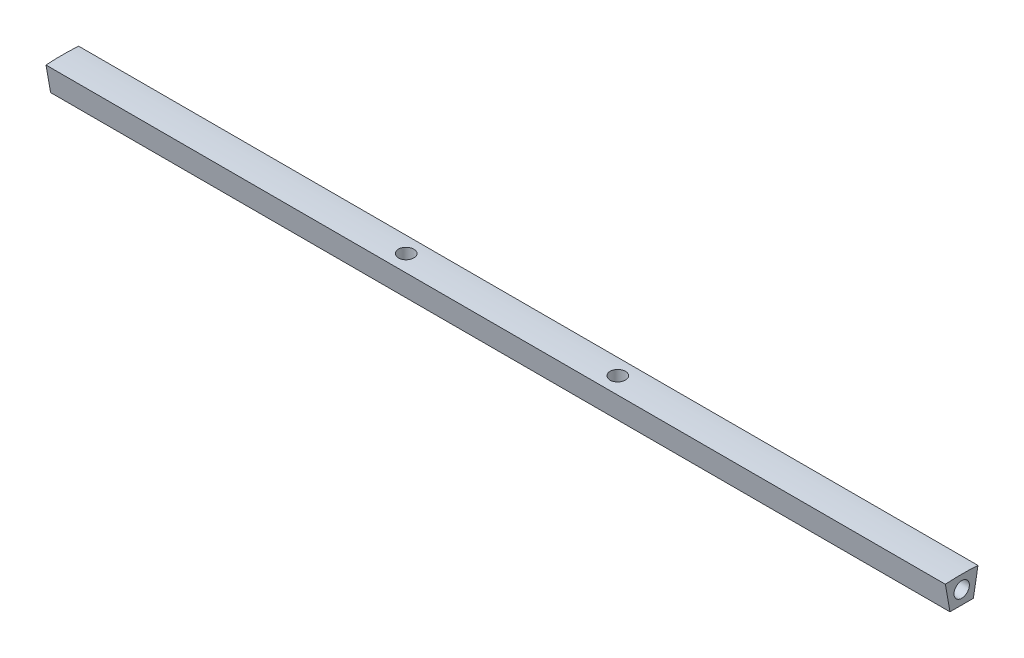
ISO-10303-21;
HEADER;
FILE_DESCRIPTION(('STEP AP214'),'2;1');
FILE_NAME('part.step','',(''),(''),'','','');
FILE_SCHEMA(('AUTOMOTIVE_DESIGN { 1 0 10303 214 1 1 1 1 }'));
ENDSEC;
DATA;
#1=APPLICATION_CONTEXT('core data for automotive mechanical design processes');
#2=APPLICATION_PROTOCOL_DEFINITION('international standard','automotive_design',2000,#1);
#3=PRODUCT_CONTEXT('',#1,'mechanical');
#4=PRODUCT('Part','Part','',(#3));
#5=PRODUCT_RELATED_PRODUCT_CATEGORY('part','',(#4));
#6=PRODUCT_DEFINITION_FORMATION('','',#4);
#7=PRODUCT_DEFINITION_CONTEXT('part definition',#1,'design');
#8=PRODUCT_DEFINITION('design','',#6,#7);
#9=PRODUCT_DEFINITION_SHAPE('','',#8);
#10=(LENGTH_UNIT() NAMED_UNIT(*) SI_UNIT(.MILLI.,.METRE.));
#11=(NAMED_UNIT(*) PLANE_ANGLE_UNIT() SI_UNIT($,.RADIAN.));
#12=(NAMED_UNIT(*) SI_UNIT($,.STERADIAN.) SOLID_ANGLE_UNIT());
#13=UNCERTAINTY_MEASURE_WITH_UNIT(LENGTH_MEASURE(1.E-05),#10,'distance_accuracy_value','');
#14=(GEOMETRIC_REPRESENTATION_CONTEXT(3) GLOBAL_UNCERTAINTY_ASSIGNED_CONTEXT((#13)) GLOBAL_UNIT_ASSIGNED_CONTEXT((#10,
#11,#12)) REPRESENTATION_CONTEXT('',''));
#15=CARTESIAN_POINT('',(0.,0.,0.));
#16=DIRECTION('',(0.,0.,1.));
#17=DIRECTION('',(1.,0.,0.));
#18=AXIS2_PLACEMENT_3D('',#15,#16,#17);
#19=CARTESIAN_POINT('',(85.,-27.3954375763557,0.));
#20=DIRECTION('',(-1.,0.,0.));
#21=DIRECTION('',(0.,0.,1.));
#22=AXIS2_PLACEMENT_3D('',#19,#20,#21);
#23=CYLINDRICAL_SURFACE('',#22,45.);
#24=CARTESIAN_POINT('',(-20.,17.5811952455887,-1.45));
#25=CARTESIAN_POINT('',(-19.9185755497555,17.581195560761,-1.44999639610573));
#26=CARTESIAN_POINT('',(-19.8370925971932,17.5814187337444,-1.44311841747033));
#27=CARTESIAN_POINT('',(-19.6763723313141,17.5822875221371,-1.41577711239342));
#28=CARTESIAN_POINT('',(-19.5971378150299,17.5829336415507,-1.39529757721871));
#29=CARTESIAN_POINT('',(-19.4432660134703,17.5845750552256,-1.34133816620006));
#30=CARTESIAN_POINT('',(-19.3686264918343,17.5855701780237,-1.30786467333882));
#31=CARTESIAN_POINT('',(-19.2260468688721,17.5877972491246,-1.22887674760692));
#32=CARTESIAN_POINT('',(-19.1581051423356,17.5890291397609,-1.18336524566251));
#33=CARTESIAN_POINT('',(-19.0307946192462,17.5915916607824,-1.08156652534249));
#34=CARTESIAN_POINT('',(-18.9714295130754,17.5929223333011,-1.02527469244733));
#35=CARTESIAN_POINT('',(-18.8629885047085,17.5955320587645,-0.903521480900382));
#36=CARTESIAN_POINT('',(-18.8139130131351,17.5968111096473,-0.838059736483198));
#37=CARTESIAN_POINT('',(-18.7274377940149,17.5991736442441,-0.699810266714487));
#38=CARTESIAN_POINT('',(-18.6900403912631,17.6002570890001,-0.627021086475463));
#39=CARTESIAN_POINT('',(-18.6279980145996,17.602105937575,-0.476193311351547));
#40=CARTESIAN_POINT('',(-18.6033529856492,17.6028713427666,-0.398154739124511));
#41=CARTESIAN_POINT('',(-18.567523177646,17.6039975967257,-0.239072314134422));
#42=CARTESIAN_POINT('',(-18.5563336912468,17.6043585869724,-0.158029522614945));
#43=CARTESIAN_POINT('',(-18.5477180910554,17.6046357939974,0.00478488025085344));
#44=CARTESIAN_POINT('',(-18.5502919177388,17.6045520126992,0.0865564884436184));
#45=CARTESIAN_POINT('',(-18.5691259176608,17.6039492413491,0.248475441193944));
#46=CARTESIAN_POINT('',(-18.5853810111596,17.603430412827,0.328623377298196));
#47=CARTESIAN_POINT('',(-18.6311082620197,17.6020162035603,0.485052254433794));
#48=CARTESIAN_POINT('',(-18.6605804507213,17.6011208219229,0.561333186295265));
#49=CARTESIAN_POINT('',(-18.7319111073349,17.5990541374583,0.707879059718868));
#50=CARTESIAN_POINT('',(-18.7737719018922,17.5978827828103,0.778142868034791));
#51=CARTESIAN_POINT('',(-18.8686897681545,17.5953961527433,0.9106475342358));
#52=CARTESIAN_POINT('',(-18.9217468700721,17.5940808769359,0.972888370470564));
#53=CARTESIAN_POINT('',(-19.0375800039693,17.5914539165918,1.0876099174053));
#54=CARTESIAN_POINT('',(-19.1003604435621,17.5901422339596,1.14008617793174));
#55=CARTESIAN_POINT('',(-19.2338426022834,17.5876709415424,1.23375469869195));
#56=CARTESIAN_POINT('',(-19.3045443227692,17.5865113317834,1.27494695699253));
#57=CARTESIAN_POINT('',(-19.4518645915983,17.5844749835096,1.34487769586793));
#58=CARTESIAN_POINT('',(-19.5284832094087,17.5835982483165,1.37361603020187));
#59=CARTESIAN_POINT('',(-19.6854612008433,17.582226646271,1.41782026852071));
#60=CARTESIAN_POINT('',(-19.7658205627223,17.5817317782196,1.43328621417523));
#61=CARTESIAN_POINT('',(-19.9279602042983,17.5811799277435,1.45050118830187));
#62=CARTESIAN_POINT('',(-20.0097398286705,17.5811227484762,1.45225638294296));
#63=CARTESIAN_POINT('',(-20.1724325696063,17.5814522093725,1.44201610203598));
#64=CARTESIAN_POINT('',(-20.2533456873345,17.5818388489395,1.43002064496979));
#65=CARTESIAN_POINT('',(-20.4119913625379,17.5830121829073,1.39262467641642));
#66=CARTESIAN_POINT('',(-20.4897245816199,17.5837987936284,1.36722696883111));
#67=CARTESIAN_POINT('',(-20.6398242090057,17.5856833255105,1.30375029232191));
#68=CARTESIAN_POINT('',(-20.7121906047513,17.5867812474,1.26567129372515));
#69=CARTESIAN_POINT('',(-20.8495307610811,17.5891651154822,1.17789707576103));
#70=CARTESIAN_POINT('',(-20.9145018669467,17.5904511288187,1.12819770440988));
#71=CARTESIAN_POINT('',(-21.0351804793051,17.5930659712476,1.018599619213));
#72=CARTESIAN_POINT('',(-21.090887959087,17.5943948004633,0.958700875959209));
#73=CARTESIAN_POINT('',(-21.1914785729168,17.5969460507688,0.830377941325694));
#74=CARTESIAN_POINT('',(-21.236357730029,17.5981684326585,0.761950631595954));
#75=CARTESIAN_POINT('',(-21.3139905509964,17.6003684382501,0.618528866792554));
#76=CARTESIAN_POINT('',(-21.3467442443823,17.6013460625482,0.543534427713156));
#77=CARTESIAN_POINT('',(-21.3991894068048,17.6029461639872,0.389122199102358));
#78=CARTESIAN_POINT('',(-21.4188834495715,17.6035687111016,0.309705284476179));
#79=CARTESIAN_POINT('',(-21.4446587085623,17.6043887602366,0.148690078274115));
#80=CARTESIAN_POINT('',(-21.4507399423086,17.6045862628042,0.067091789506192));
#81=CARTESIAN_POINT('',(-21.4491166661379,17.6045339642031,-0.0959301631536992));
#82=CARTESIAN_POINT('',(-21.4414184184504,17.6042843662238,-0.177353889541331));
#83=CARTESIAN_POINT('',(-21.4124675914789,17.6033663876483,-0.337752548323752));
#84=CARTESIAN_POINT('',(-21.3912149854502,17.6026980062259,-0.416727475886395));
#85=CARTESIAN_POINT('',(-21.335759663018,17.601017738147,-0.569988930491637));
#86=CARTESIAN_POINT('',(-21.3015567369522,17.6000058459292,-0.644275381606328));
#87=CARTESIAN_POINT('',(-21.2211736125113,17.5977525525986,-0.786050309944264));
#88=CARTESIAN_POINT('',(-21.1749938416078,17.5965111596776,-0.853539029669344));
#89=CARTESIAN_POINT('',(-21.0719486540127,17.5939381420972,-0.979832024541534));
#90=CARTESIAN_POINT('',(-21.0150795268562,17.592606486209,-1.03863327141638));
#91=CARTESIAN_POINT('',(-20.8922601580862,17.5900030367265,-1.14587017928332));
#92=CARTESIAN_POINT('',(-20.8263076725901,17.5887312580283,-1.1943032714316));
#93=CARTESIAN_POINT('',(-20.6871656913398,17.5863905082374,-1.27943850646351));
#94=CARTESIAN_POINT('',(-20.6139713405715,17.5853216746215,-1.31613270875393));
#95=CARTESIAN_POINT('',(-20.4625138171707,17.5835098212649,-1.3766687565962));
#96=CARTESIAN_POINT('',(-20.3842568093504,17.582766413515,-1.40052591573039));
#97=CARTESIAN_POINT('',(-20.2545884632373,17.5818878005388,-1.42839386265571));
#98=CARTESIAN_POINT('',(-20.2040186315184,17.5816292222113,-1.43648595639032));
#99=CARTESIAN_POINT('',(-20.1023068996895,17.5812828457423,-1.44729015643992));
#100=CARTESIAN_POINT('',(-20.0511649997749,17.5811950475426,-1.45000226459312));
#101=CARTESIAN_POINT('',(-20.,17.5811952455887,-1.45));
#102=B_SPLINE_CURVE_WITH_KNOTS('',3,(#24,#25,#26,#27,#28,#29,#30,#31,#32,#33,#34,#35,#36,#37,
#38,#39,#40,#41,#42,#43,#44,#45,#46,#47,#48,#49,#50,#51,#52,#53,#54,#55,#56,#57,#58,#59,#60,#61,
#62,#63,#64,#65,#66,#67,#68,#69,#70,#71,#72,#73,#74,#75,#76,#77,#78,#79,#80,#81,#82,#83,#84,#85,
#86,#87,#88,#89,#90,#91,#92,#93,#94,#95,#96,#97,#98,#99,#100,#101),.UNSPECIFIED.,.T.,.F.,(4,2,2,
2,2,2,2,2,2,2,2,2,2,2,2,2,2,2,2,2,2,2,2,2,2,2,2,2,2,2,2,2,2,2,2,2,2,2,4),(0.,0.24408659065921,
0.488464578135991,0.732722672151012,0.976921350648962,1.22122479295396,1.46553798270357,
1.70989977771351,1.9542605180567,2.19853574526446,2.44280991601687,2.68699342980523,
2.931177522602,3.1754075035857,3.41963814362032,3.66397981980311,3.90832153784673,
4.15266612500845,4.39700994502987,4.64124386938818,4.88547746547869,5.12965998539411,
5.37384307667462,5.6181135487785,5.86238472520444,6.10674547940481,6.35110563848043,
6.59541762596839,6.83972929898211,7.08392997018898,7.32813112323952,7.57233623001097,
7.81653262193724,8.06081393582274,8.30515570367844,8.54966240502629,8.7938767788072,
8.94725447538027,9.1006321195477),.UNSPECIFIED.);
#103=CARTESIAN_POINT('',(-20.,17.5811952455887,-1.45));
#104=VERTEX_POINT('',#103);
#105=EDGE_CURVE('E147',#104,#104,#102,.T.);
#106=ORIENTED_EDGE('',*,*,#105,.T.);
#107=EDGE_LOOP('',(#106));
#108=FACE_BOUND('',#107,.T.);
#109=CARTESIAN_POINT('',(20.,17.5811952455887,-1.45));
#110=CARTESIAN_POINT('',(20.0814244502446,17.581195560761,-1.44999639610573));
#111=CARTESIAN_POINT('',(20.1629074028068,17.5814187337444,-1.44311841747033));
#112=CARTESIAN_POINT('',(20.3236276686859,17.5822875221371,-1.41577711239342));
#113=CARTESIAN_POINT('',(20.4028621849702,17.5829336415507,-1.39529757721871));
#114=CARTESIAN_POINT('',(20.5567339865297,17.5845750552256,-1.34133816620006));
#115=CARTESIAN_POINT('',(20.6313735081658,17.5855701780237,-1.30786467333882));
#116=CARTESIAN_POINT('',(20.773953131128,17.5877972491246,-1.22887674760692));
#117=CARTESIAN_POINT('',(20.8418948576645,17.5890291397609,-1.18336524566251));
#118=CARTESIAN_POINT('',(20.9692053807538,17.5915916607824,-1.08156652534249));
#119=CARTESIAN_POINT('',(21.0285704869247,17.5929223333011,-1.02527469244733));
#120=CARTESIAN_POINT('',(21.1370114952915,17.5955320587645,-0.903521480900382));
#121=CARTESIAN_POINT('',(21.1860869868649,17.5968111096473,-0.838059736483198));
#122=CARTESIAN_POINT('',(21.2725622059851,17.5991736442441,-0.699810266714487));
#123=CARTESIAN_POINT('',(21.3099596087369,17.6002570890001,-0.627021086475463));
#124=CARTESIAN_POINT('',(21.3720019854004,17.602105937575,-0.476193311351547));
#125=CARTESIAN_POINT('',(21.3966470143509,17.6028713427666,-0.398154739124511));
#126=CARTESIAN_POINT('',(21.4324768223541,17.6039975967257,-0.239072314134422));
#127=CARTESIAN_POINT('',(21.4436663087532,17.6043585869724,-0.158029522614945));
#128=CARTESIAN_POINT('',(21.4522819089446,17.6046357939974,0.00478488025085344));
#129=CARTESIAN_POINT('',(21.4497080822612,17.6045520126992,0.0865564884436184));
#130=CARTESIAN_POINT('',(21.4308740823392,17.6039492413491,0.248475441193944));
#131=CARTESIAN_POINT('',(21.4146189888404,17.603430412827,0.328623377298196));
#132=CARTESIAN_POINT('',(21.3688917379803,17.6020162035603,0.485052254433794));
#133=CARTESIAN_POINT('',(21.3394195492788,17.6011208219229,0.561333186295265));
#134=CARTESIAN_POINT('',(21.2680888926651,17.5990541374583,0.707879059718868));
#135=CARTESIAN_POINT('',(21.2262280981078,17.5978827828103,0.778142868034791));
#136=CARTESIAN_POINT('',(21.1313102318455,17.5953961527433,0.9106475342358));
#137=CARTESIAN_POINT('',(21.0782531299279,17.5940808769359,0.972888370470564));
#138=CARTESIAN_POINT('',(20.9624199960307,17.5914539165918,1.0876099174053));
#139=CARTESIAN_POINT('',(20.899639556438,17.5901422339596,1.14008617793174));
#140=CARTESIAN_POINT('',(20.7661573977166,17.5876709415424,1.23375469869195));
#141=CARTESIAN_POINT('',(20.6954556772308,17.5865113317834,1.27494695699253));
#142=CARTESIAN_POINT('',(20.5481354084018,17.5844749835096,1.34487769586793));
#143=CARTESIAN_POINT('',(20.4715167905914,17.5835982483165,1.37361603020187));
#144=CARTESIAN_POINT('',(20.3145387991568,17.582226646271,1.41782026852071));
#145=CARTESIAN_POINT('',(20.2341794372777,17.5817317782196,1.43328621417523));
#146=CARTESIAN_POINT('',(20.0720397957017,17.5811799277435,1.45050118830187));
#147=CARTESIAN_POINT('',(19.9902601713296,17.5811227484762,1.45225638294296));
#148=CARTESIAN_POINT('',(19.8275674303938,17.5814522093725,1.44201610203598));
#149=CARTESIAN_POINT('',(19.7466543126656,17.5818388489395,1.43002064496979));
#150=CARTESIAN_POINT('',(19.5880086374621,17.5830121829073,1.39262467641642));
#151=CARTESIAN_POINT('',(19.5102754183801,17.5837987936284,1.36722696883111));
#152=CARTESIAN_POINT('',(19.3601757909943,17.5856833255105,1.30375029232191));
#153=CARTESIAN_POINT('',(19.2878093952487,17.5867812474,1.26567129372515));
#154=CARTESIAN_POINT('',(19.150469238919,17.5891651154822,1.17789707576103));
#155=CARTESIAN_POINT('',(19.0854981330533,17.5904511288187,1.12819770440988));
#156=CARTESIAN_POINT('',(18.9648195206949,17.5930659712476,1.018599619213));
#157=CARTESIAN_POINT('',(18.909112040913,17.5943948004633,0.958700875959209));
#158=CARTESIAN_POINT('',(18.8085214270832,17.5969460507688,0.830377941325694));
#159=CARTESIAN_POINT('',(18.763642269971,17.5981684326585,0.761950631595954));
#160=CARTESIAN_POINT('',(18.6860094490036,17.6003684382501,0.618528866792554));
#161=CARTESIAN_POINT('',(18.6532557556178,17.6013460625482,0.543534427713156));
#162=CARTESIAN_POINT('',(18.6008105931952,17.6029461639872,0.389122199102358));
#163=CARTESIAN_POINT('',(18.5811165504286,17.6035687111016,0.309705284476179));
#164=CARTESIAN_POINT('',(18.5553412914378,17.6043887602366,0.148690078274115));
#165=CARTESIAN_POINT('',(18.5492600576914,17.6045862628042,0.067091789506192));
#166=CARTESIAN_POINT('',(18.5508833338621,17.6045339642031,-0.0959301631536996));
#167=CARTESIAN_POINT('',(18.5585815815496,17.6042843662238,-0.177353889541332));
#168=CARTESIAN_POINT('',(18.5875324085212,17.6033663876483,-0.337752548323753));
#169=CARTESIAN_POINT('',(18.6087850145498,17.6026980062259,-0.416727475886395));
#170=CARTESIAN_POINT('',(18.6642403369821,17.601017738147,-0.569988930491637));
#171=CARTESIAN_POINT('',(18.6984432630479,17.6000058459292,-0.644275381606329));
#172=CARTESIAN_POINT('',(18.7788263874887,17.5977525525986,-0.786050309944265));
#173=CARTESIAN_POINT('',(18.8250061583923,17.5965111596776,-0.853539029669344));
#174=CARTESIAN_POINT('',(18.9280513459873,17.5939381420972,-0.979832024541534));
#175=CARTESIAN_POINT('',(18.9849204731438,17.592606486209,-1.03863327141638));
#176=CARTESIAN_POINT('',(19.1077398419138,17.5900030367265,-1.14587017928332));
#177=CARTESIAN_POINT('',(19.1736923274099,17.5887312580283,-1.1943032714316));
#178=CARTESIAN_POINT('',(19.3128343086602,17.5863905082374,-1.27943850646351));
#179=CARTESIAN_POINT('',(19.3860286594286,17.5853216746215,-1.31613270875393));
#180=CARTESIAN_POINT('',(19.5374861828293,17.5835098212649,-1.3766687565962));
#181=CARTESIAN_POINT('',(19.6157431906496,17.582766413515,-1.40052591573039));
#182=CARTESIAN_POINT('',(19.7454115367628,17.5818878005388,-1.42839386265571));
#183=CARTESIAN_POINT('',(19.7959813684817,17.5816292222113,-1.43648595639032));
#184=CARTESIAN_POINT('',(19.8976931003106,17.5812828457423,-1.44729015643992));
#185=CARTESIAN_POINT('',(19.9488350002251,17.5811950475426,-1.45000226459312));
#186=CARTESIAN_POINT('',(20.,17.5811952455887,-1.45));
#187=B_SPLINE_CURVE_WITH_KNOTS('',3,(#109,#110,#111,#112,#113,#114,#115,#116,#117,#118,#119,
#120,#121,#122,#123,#124,#125,#126,#127,#128,#129,#130,#131,#132,#133,#134,#135,#136,#137,#138,
#139,#140,#141,#142,#143,#144,#145,#146,#147,#148,#149,#150,#151,#152,#153,#154,#155,#156,#157,
#158,#159,#160,#161,#162,#163,#164,#165,#166,#167,#168,#169,#170,#171,#172,#173,#174,#175,#176,
#177,#178,#179,#180,#181,#182,#183,#184,#185,#186),.UNSPECIFIED.,.T.,.F.,(4,2,2,2,2,2,2,2,2,2,2,
2,2,2,2,2,2,2,2,2,2,2,2,2,2,2,2,2,2,2,2,2,2,2,2,2,2,2,4),(0.,0.24408659065921,0.488464578135991,
0.732722672151007,0.976921350648962,1.22122479295396,1.46553798270357,1.70989977771351,
1.9542605180567,2.19853574526446,2.44280991601687,2.68699342980523,2.931177522602,
3.1754075035857,3.41963814362032,3.66397981980311,3.90832153784673,4.15266612500845,
4.39700994502987,4.64124386938818,4.88547746547869,5.12965998539411,5.37384307667462,
5.6181135487785,5.86238472520444,6.10674547940481,6.35110563848043,6.59541762596839,
6.83972929898211,7.08392997018898,7.32813112323952,7.57233623001097,7.81653262193724,
8.06081393582273,8.30515570367844,8.54966240502628,8.79387677880719,8.94725447538026,
9.1006321195477),.UNSPECIFIED.);
#188=CARTESIAN_POINT('',(20.,17.5811952455887,-1.45));
#189=VERTEX_POINT('',#188);
#190=EDGE_CURVE('E158',#189,#189,#187,.T.);
#191=ORIENTED_EDGE('',*,*,#190,.T.);
#192=EDGE_LOOP('',(#191));
#193=FACE_BOUND('',#192,.T.);
#194=CARTESIAN_POINT('',(-85.,-27.3954375763557,0.));
#195=DIRECTION('',(1.,0.,0.));
#196=DIRECTION('',(0.,0.,1.));
#197=AXIS2_PLACEMENT_3D('',#194,#195,#196);
#198=CIRCLE('',#197,45.);
#199=CARTESIAN_POINT('',(-85.,17.4986575754162,-3.08548545672432));
#200=VERTEX_POINT('',#199);
#201=CARTESIAN_POINT('',(-85.,17.4986575754162,3.08548545672432));
#202=VERTEX_POINT('',#201);
#203=EDGE_CURVE('E114',#200,#202,#198,.T.);
#204=ORIENTED_EDGE('',*,*,#203,.T.);
#205=DIRECTION('',(-1.,0.,0.));
#206=VECTOR('',#205,1.);
#207=CARTESIAN_POINT('',(85.,17.4986575754162,3.08548545672432));
#208=LINE('',#207,#206);
#209=CARTESIAN_POINT('',(85.,17.4986575754162,3.08548545672432));
#210=VERTEX_POINT('',#209);
#211=EDGE_CURVE('E11',#210,#202,#208,.T.);
#212=ORIENTED_EDGE('',*,*,#211,.F.);
#213=CARTESIAN_POINT('',(85.,-27.3954375763557,0.));
#214=DIRECTION('',(1.,0.,0.));
#215=DIRECTION('',(0.,0.,1.));
#216=AXIS2_PLACEMENT_3D('',#213,#214,#215);
#217=CIRCLE('',#216,45.);
#218=CARTESIAN_POINT('',(85.,17.4986575754162,-3.08548545672432));
#219=VERTEX_POINT('',#218);
#220=EDGE_CURVE('E98',#219,#210,#217,.T.);
#221=ORIENTED_EDGE('',*,*,#220,.F.);
#222=DIRECTION('',(-1.,0.,0.));
#223=VECTOR('',#222,1.);
#224=CARTESIAN_POINT('',(85.,17.4986575754162,-3.08548545672432));
#225=LINE('',#224,#223);
#226=EDGE_CURVE('E110',#219,#200,#225,.T.);
#227=ORIENTED_EDGE('',*,*,#226,.T.);
#228=EDGE_LOOP('',(#204,#212,#221,#227));
#229=FACE_BOUND('',#228,.T.);
#230=ADVANCED_FACE('F45',(#108,#193,#229),#23,.T.);
#231=CARTESIAN_POINT('',(85.,17.4986575754162,3.08548545672432));
#232=DIRECTION('',(0.,0.173648177666924,-0.984807753012209));
#233=DIRECTION('',(0.,0.984807753012209,0.173648177666924));
#234=AXIS2_PLACEMENT_3D('',#231,#232,#233);
#235=PLANE('',#234);
#236=DIRECTION('',(0.,-0.984807753012209,-0.173648177666924));
#237=VECTOR('',#236,1.);
#238=CARTESIAN_POINT('',(-85.,17.4986575754162,3.08548545672432));
#239=LINE('',#238,#237);
#240=CARTESIAN_POINT('',(-85.,12.5433685074548,2.21173429683306));
#241=VERTEX_POINT('',#240);
#242=EDGE_CURVE('E103',#202,#241,#239,.T.);
#243=ORIENTED_EDGE('',*,*,#242,.T.);
#244=DIRECTION('',(-1.,0.,0.));
#245=VECTOR('',#244,1.);
#246=CARTESIAN_POINT('',(85.,12.5433685074548,2.21173429683306));
#247=LINE('',#246,#245);
#248=CARTESIAN_POINT('',(85.,12.5433685074548,2.21173429683306));
#249=VERTEX_POINT('',#248);
#250=EDGE_CURVE('E55',#249,#241,#247,.T.);
#251=ORIENTED_EDGE('',*,*,#250,.F.);
#252=DIRECTION('',(0.,-0.984807753012209,-0.173648177666924));
#253=VECTOR('',#252,1.);
#254=CARTESIAN_POINT('',(85.,17.4986575754162,3.08548545672432));
#255=LINE('',#254,#253);
#256=EDGE_CURVE('E93',#210,#249,#255,.T.);
#257=ORIENTED_EDGE('',*,*,#256,.F.);
#258=ORIENTED_EDGE('',*,*,#211,.T.);
#259=EDGE_LOOP('',(#243,#251,#257,#258));
#260=FACE_BOUND('',#259,.T.);
#261=ADVANCED_FACE('F102',(#260),#235,.F.);
#262=CARTESIAN_POINT('',(85.,12.5433685074548,2.21173429683306));
#263=DIRECTION('',(0.,1.,0.));
#264=DIRECTION('',(0.,0.,1.));
#265=AXIS2_PLACEMENT_3D('',#262,#263,#264);
#266=PLANE('',#265);
#267=CARTESIAN_POINT('',(-20.,12.5433685074548,0.));
#268=DIRECTION('',(0.,-1.,0.));
#269=DIRECTION('',(0.,0.,-1.));
#270=AXIS2_PLACEMENT_3D('',#267,#268,#269);
#271=CIRCLE('',#270,1.45);
#272=CARTESIAN_POINT('',(-20.,12.5433685074548,-1.45));
#273=VERTEX_POINT('',#272);
#274=EDGE_CURVE('E212',#273,#273,#271,.T.);
#275=ORIENTED_EDGE('',*,*,#274,.F.);
#276=EDGE_LOOP('',(#275));
#277=FACE_BOUND('',#276,.T.);
#278=CARTESIAN_POINT('',(20.,12.5433685074548,0.));
#279=DIRECTION('',(0.,-1.,0.));
#280=DIRECTION('',(0.,0.,-1.));
#281=AXIS2_PLACEMENT_3D('',#278,#279,#280);
#282=CIRCLE('',#281,1.45);
#283=CARTESIAN_POINT('',(20.,12.5433685074548,-1.45));
#284=VERTEX_POINT('',#283);
#285=EDGE_CURVE('E215',#284,#284,#282,.T.);
#286=ORIENTED_EDGE('',*,*,#285,.F.);
#287=EDGE_LOOP('',(#286));
#288=FACE_BOUND('',#287,.T.);
#289=DIRECTION('',(0.,0.,-1.));
#290=VECTOR('',#289,1.);
#291=CARTESIAN_POINT('',(-85.,12.5433685074548,2.21173429683306));
#292=LINE('',#291,#290);
#293=CARTESIAN_POINT('',(-85.,12.5433685074548,-2.21173429683306));
#294=VERTEX_POINT('',#293);
#295=EDGE_CURVE('E80',#241,#294,#292,.T.);
#296=ORIENTED_EDGE('',*,*,#295,.T.);
#297=DIRECTION('',(-1.,0.,0.));
#298=VECTOR('',#297,1.);
#299=CARTESIAN_POINT('',(85.,12.5433685074548,-2.21173429683306));
#300=LINE('',#299,#298);
#301=CARTESIAN_POINT('',(85.,12.5433685074548,-2.21173429683306));
#302=VERTEX_POINT('',#301);
#303=EDGE_CURVE('E105',#302,#294,#300,.T.);
#304=ORIENTED_EDGE('',*,*,#303,.F.);
#305=DIRECTION('',(0.,0.,-1.));
#306=VECTOR('',#305,1.);
#307=CARTESIAN_POINT('',(85.,12.5433685074548,2.21173429683306));
#308=LINE('',#307,#306);
#309=EDGE_CURVE('E96',#249,#302,#308,.T.);
#310=ORIENTED_EDGE('',*,*,#309,.F.);
#311=ORIENTED_EDGE('',*,*,#250,.T.);
#312=EDGE_LOOP('',(#296,#304,#310,#311));
#313=FACE_BOUND('',#312,.T.);
#314=ADVANCED_FACE('F106',(#277,#288,#313),#266,.F.);
#315=CARTESIAN_POINT('',(85.,12.5433685074548,-2.21173429683306));
#316=DIRECTION('',(0.,0.173648177666924,0.984807753012209));
#317=DIRECTION('',(0.,-0.984807753012209,0.173648177666924));
#318=AXIS2_PLACEMENT_3D('',#315,#316,#317);
#319=PLANE('',#318);
#320=DIRECTION('',(0.,0.984807753012209,-0.173648177666924));
#321=VECTOR('',#320,1.);
#322=CARTESIAN_POINT('',(-85.,12.5433685074548,-2.21173429683306));
#323=LINE('',#322,#321);
#324=EDGE_CURVE('E86',#294,#200,#323,.T.);
#325=ORIENTED_EDGE('',*,*,#324,.T.);
#326=ORIENTED_EDGE('',*,*,#226,.F.);
#327=DIRECTION('',(0.,0.984807753012209,-0.173648177666924));
#328=VECTOR('',#327,1.);
#329=CARTESIAN_POINT('',(85.,12.5433685074548,-2.21173429683306));
#330=LINE('',#329,#328);
#331=EDGE_CURVE('E63',#302,#219,#330,.T.);
#332=ORIENTED_EDGE('',*,*,#331,.F.);
#333=ORIENTED_EDGE('',*,*,#303,.T.);
#334=EDGE_LOOP('',(#325,#326,#332,#333));
#335=FACE_BOUND('',#334,.T.);
#336=ADVANCED_FACE('F128',(#335),#319,.F.);
#337=CARTESIAN_POINT('',(85.,-27.3954375763557,0.));
#338=DIRECTION('',(-1.,0.,0.));
#339=DIRECTION('',(0.,0.,1.));
#340=AXIS2_PLACEMENT_3D('',#337,#338,#339);
#341=PLANE('',#340);
#342=CARTESIAN_POINT('',(85.,15.1045624236443,0.));
#343=DIRECTION('',(1.,0.,0.));
#344=DIRECTION('',(0.,0.,-1.));
#345=AXIS2_PLACEMENT_3D('',#342,#343,#344);
#346=CIRCLE('',#345,1.45);
#347=CARTESIAN_POINT('',(85.,15.1045624236443,-1.45));
#348=VERTEX_POINT('',#347);
#349=EDGE_CURVE('E135',#348,#348,#346,.T.);
#350=ORIENTED_EDGE('',*,*,#349,.F.);
#351=EDGE_LOOP('',(#350));
#352=FACE_BOUND('',#351,.T.);
#353=ORIENTED_EDGE('',*,*,#220,.T.);
#354=ORIENTED_EDGE('',*,*,#256,.T.);
#355=ORIENTED_EDGE('',*,*,#309,.T.);
#356=ORIENTED_EDGE('',*,*,#331,.T.);
#357=EDGE_LOOP('',(#353,#354,#355,#356));
#358=FACE_BOUND('',#357,.T.);
#359=ADVANCED_FACE('F94',(#352,#358),#341,.F.);
#360=CARTESIAN_POINT('',(-85.,-27.3954375763557,0.));
#361=DIRECTION('',(-1.,0.,0.));
#362=DIRECTION('',(0.,0.,1.));
#363=AXIS2_PLACEMENT_3D('',#360,#361,#362);
#364=PLANE('',#363);
#365=CARTESIAN_POINT('',(-85.,15.1045624236443,0.));
#366=DIRECTION('',(1.,0.,0.));
#367=DIRECTION('',(0.,0.,-1.));
#368=AXIS2_PLACEMENT_3D('',#365,#366,#367);
#369=CIRCLE('',#368,1.45);
#370=CARTESIAN_POINT('',(-85.,15.1045624236443,-1.45));
#371=VERTEX_POINT('',#370);
#372=EDGE_CURVE('E143',#371,#371,#369,.T.);
#373=ORIENTED_EDGE('',*,*,#372,.T.);
#374=EDGE_LOOP('',(#373));
#375=FACE_BOUND('',#374,.T.);
#376=ORIENTED_EDGE('',*,*,#203,.F.);
#377=ORIENTED_EDGE('',*,*,#324,.F.);
#378=ORIENTED_EDGE('',*,*,#295,.F.);
#379=ORIENTED_EDGE('',*,*,#242,.F.);
#380=EDGE_LOOP('',(#376,#377,#378,#379));
#381=FACE_BOUND('',#380,.T.);
#382=ADVANCED_FACE('F131',(#375,#381),#364,.T.);
#383=CARTESIAN_POINT('',(75.,15.1045624236443,0.));
#384=DIRECTION('',(1.,0.,0.));
#385=DIRECTION('',(0.,0.,-1.));
#386=AXIS2_PLACEMENT_3D('',#383,#384,#385);
#387=CYLINDRICAL_SURFACE('',#386,1.45);
#388=CARTESIAN_POINT('',(75.,15.1045624236443,0.));
#389=DIRECTION('',(1.,0.,0.));
#390=DIRECTION('',(0.,0.,-1.));
#391=AXIS2_PLACEMENT_3D('',#388,#389,#390);
#392=CIRCLE('',#391,1.45);
#393=CARTESIAN_POINT('',(75.,15.1045624236443,-1.45));
#394=VERTEX_POINT('',#393);
#395=EDGE_CURVE('E118',#394,#394,#392,.T.);
#396=ORIENTED_EDGE('',*,*,#395,.F.);
#397=EDGE_LOOP('',(#396));
#398=FACE_BOUND('',#397,.T.);
#399=ORIENTED_EDGE('',*,*,#349,.T.);
#400=EDGE_LOOP('',(#399));
#401=FACE_BOUND('',#400,.T.);
#402=ADVANCED_FACE('F184',(#398,#401),#387,.F.);
#403=CARTESIAN_POINT('',(75.,15.1045624236443,0.));
#404=DIRECTION('',(1.,0.,0.));
#405=DIRECTION('',(0.,0.,-1.));
#406=AXIS2_PLACEMENT_3D('',#403,#404,#405);
#407=PLANE('',#406);
#408=ORIENTED_EDGE('',*,*,#395,.T.);
#409=EDGE_LOOP('',(#408));
#410=FACE_BOUND('',#409,.T.);
#411=ADVANCED_FACE('F180',(#410),#407,.T.);
#412=CARTESIAN_POINT('',(-75.,15.1045624236443,0.));
#413=DIRECTION('',(-1.,0.,0.));
#414=DIRECTION('',(0.,0.,1.));
#415=AXIS2_PLACEMENT_3D('',#412,#413,#414);
#416=CYLINDRICAL_SURFACE('',#415,1.45);
#417=CARTESIAN_POINT('',(-75.,15.1045624236443,0.));
#418=DIRECTION('',(1.,0.,0.));
#419=DIRECTION('',(0.,0.,-1.));
#420=AXIS2_PLACEMENT_3D('',#417,#418,#419);
#421=CIRCLE('',#420,1.45);
#422=CARTESIAN_POINT('',(-75.,15.1045624236443,-1.45));
#423=VERTEX_POINT('',#422);
#424=EDGE_CURVE('E139',#423,#423,#421,.T.);
#425=ORIENTED_EDGE('',*,*,#424,.T.);
#426=EDGE_LOOP('',(#425));
#427=FACE_BOUND('',#426,.T.);
#428=ORIENTED_EDGE('',*,*,#372,.F.);
#429=EDGE_LOOP('',(#428));
#430=FACE_BOUND('',#429,.T.);
#431=ADVANCED_FACE('F176',(#427,#430),#416,.F.);
#432=CARTESIAN_POINT('',(-75.,15.1045624236443,0.));
#433=DIRECTION('',(-1.,0.,0.));
#434=DIRECTION('',(0.,0.,-1.));
#435=AXIS2_PLACEMENT_3D('',#432,#433,#434);
#436=PLANE('',#435);
#437=ORIENTED_EDGE('',*,*,#424,.F.);
#438=EDGE_LOOP('',(#437));
#439=FACE_BOUND('',#438,.T.);
#440=ADVANCED_FACE('F172',(#439),#436,.T.);
#441=CARTESIAN_POINT('',(20.,22.5433685074548,0.));
#442=DIRECTION('',(0.,-1.,0.));
#443=DIRECTION('',(0.,0.,-1.));
#444=AXIS2_PLACEMENT_3D('',#441,#442,#443);
#445=CYLINDRICAL_SURFACE('',#444,1.45);
#446=ORIENTED_EDGE('',*,*,#285,.T.);
#447=EDGE_LOOP('',(#446));
#448=FACE_BOUND('',#447,.T.);
#449=ORIENTED_EDGE('',*,*,#190,.F.);
#450=EDGE_LOOP('',(#449));
#451=FACE_BOUND('',#450,.T.);
#452=ADVANCED_FACE('F167',(#448,#451),#445,.F.);
#453=CARTESIAN_POINT('',(-20.,22.5433685074548,0.));
#454=DIRECTION('',(0.,-1.,0.));
#455=DIRECTION('',(0.,0.,-1.));
#456=AXIS2_PLACEMENT_3D('',#453,#454,#455);
#457=CYLINDRICAL_SURFACE('',#456,1.45);
#458=ORIENTED_EDGE('',*,*,#274,.T.);
#459=EDGE_LOOP('',(#458));
#460=FACE_BOUND('',#459,.T.);
#461=ORIENTED_EDGE('',*,*,#105,.F.);
#462=EDGE_LOOP('',(#461));
#463=FACE_BOUND('',#462,.T.);
#464=ADVANCED_FACE('F164',(#460,#463),#457,.F.);
#465=CLOSED_SHELL('',(#230,#261,#314,#336,#359,#382,#402,#411,#431,#440,#452,#464));
#466=MANIFOLD_SOLID_BREP('B2',#465);
#467=ADVANCED_BREP_SHAPE_REPRESENTATION('',(#18,#466),#14);
#468=SHAPE_DEFINITION_REPRESENTATION(#9,#467);
ENDSEC;
END-ISO-10303-21;
